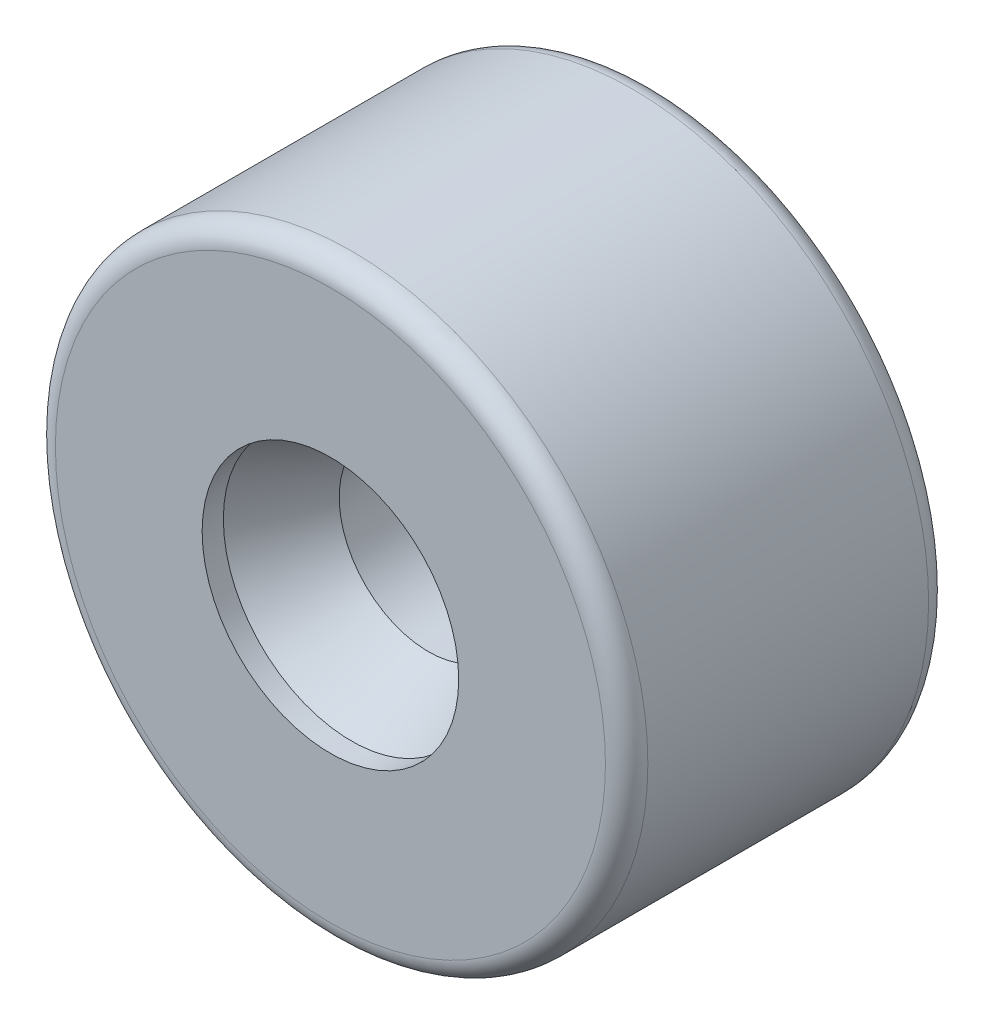
ISO-10303-21;
HEADER;
FILE_DESCRIPTION(('STEP AP214'),'2;1');
FILE_NAME('part.step','',(''),(''),'','','');
FILE_SCHEMA(('AUTOMOTIVE_DESIGN { 1 0 10303 214 1 1 1 1 }'));
ENDSEC;
DATA;
#1=APPLICATION_CONTEXT('core data for automotive mechanical design processes');
#2=APPLICATION_PROTOCOL_DEFINITION('international standard','automotive_design',2000,#1);
#3=PRODUCT_CONTEXT('',#1,'mechanical');
#4=PRODUCT('Part','Part','',(#3));
#5=PRODUCT_RELATED_PRODUCT_CATEGORY('part','',(#4));
#6=PRODUCT_DEFINITION_FORMATION('','',#4);
#7=PRODUCT_DEFINITION_CONTEXT('part definition',#1,'design');
#8=PRODUCT_DEFINITION('design','',#6,#7);
#9=PRODUCT_DEFINITION_SHAPE('','',#8);
#10=(LENGTH_UNIT() NAMED_UNIT(*) SI_UNIT(.MILLI.,.METRE.));
#11=(NAMED_UNIT(*) PLANE_ANGLE_UNIT() SI_UNIT($,.RADIAN.));
#12=(NAMED_UNIT(*) SI_UNIT($,.STERADIAN.) SOLID_ANGLE_UNIT());
#13=UNCERTAINTY_MEASURE_WITH_UNIT(LENGTH_MEASURE(1.E-05),#10,'distance_accuracy_value','');
#14=(GEOMETRIC_REPRESENTATION_CONTEXT(3) GLOBAL_UNCERTAINTY_ASSIGNED_CONTEXT((#13)) GLOBAL_UNIT_ASSIGNED_CONTEXT((#10,
#11,#12)) REPRESENTATION_CONTEXT('',''));
#15=CARTESIAN_POINT('',(0.,0.,0.));
#16=DIRECTION('',(0.,0.,1.));
#17=DIRECTION('',(1.,0.,0.));
#18=AXIS2_PLACEMENT_3D('',#15,#16,#17);
#19=CARTESIAN_POINT('',(0.,63.5000000000001,-76.2));
#20=DIRECTION('',(0.,0.,1.));
#21=DIRECTION('',(1.,0.,0.));
#22=AXIS2_PLACEMENT_3D('',#19,#20,#21);
#23=PLANE('',#22);
#24=CARTESIAN_POINT('',(0.,0.,-76.2));
#25=DIRECTION('',(0.,0.,1.));
#26=DIRECTION('',(1.,0.,0.));
#27=AXIS2_PLACEMENT_3D('',#24,#25,#26);
#28=CIRCLE('',#27,60.5000000000001);
#29=CARTESIAN_POINT('',(60.5000000000001,0.,-76.2));
#30=VERTEX_POINT('',#29);
#31=EDGE_CURVE('E10',#30,#30,#28,.T.);
#32=ORIENTED_EDGE('',*,*,#31,.T.);
#33=EDGE_LOOP('',(#32));
#34=FACE_BOUND('',#33,.T.);
#35=CARTESIAN_POINT('',(0.,0.,-76.2));
#36=DIRECTION('',(0.,0.,1.));
#37=DIRECTION('',(1.,0.,0.));
#38=AXIS2_PLACEMENT_3D('',#35,#36,#37);
#39=CIRCLE('',#38,129.7);
#40=CARTESIAN_POINT('',(129.7,0.,-76.2));
#41=VERTEX_POINT('',#40);
#42=EDGE_CURVE('E153',#41,#41,#39,.T.);
#43=ORIENTED_EDGE('',*,*,#42,.F.);
#44=EDGE_LOOP('',(#43));
#45=FACE_BOUND('',#44,.T.);
#46=ADVANCED_FACE('F37',(#34,#45),#23,.F.);
#47=CARTESIAN_POINT('',(0.,0.,361.478930537487));
#48=DIRECTION('',(0.,0.,1.));
#49=DIRECTION('',(1.,0.,0.));
#50=AXIS2_PLACEMENT_3D('',#47,#48,#49);
#51=CYLINDRICAL_SURFACE('',#50,60.5000000000001);
#52=ORIENTED_EDGE('',*,*,#31,.F.);
#53=EDGE_LOOP('',(#52));
#54=FACE_BOUND('',#53,.T.);
#55=CARTESIAN_POINT('',(0.,0.,-66.2));
#56=DIRECTION('',(0.,0.,1.));
#57=DIRECTION('',(1.,0.,0.));
#58=AXIS2_PLACEMENT_3D('',#55,#56,#57);
#59=CIRCLE('',#58,60.5000000000001);
#60=CARTESIAN_POINT('',(60.5000000000001,0.,-66.2));
#61=VERTEX_POINT('',#60);
#62=EDGE_CURVE('E44',#61,#61,#59,.T.);
#63=ORIENTED_EDGE('',*,*,#62,.T.);
#64=EDGE_LOOP('',(#63));
#65=FACE_BOUND('',#64,.T.);
#66=ADVANCED_FACE('F145',(#54,#65),#51,.F.);
#67=CARTESIAN_POINT('',(0.,0.,-30.));
#68=DIRECTION('',(0.,0.,-1.));
#69=DIRECTION('',(-1.,0.,0.));
#70=AXIS2_PLACEMENT_3D('',#67,#68,#69);
#71=CONICAL_SURFACE('',#70,42.0551787283017,0.471238898038469);
#72=ORIENTED_EDGE('',*,*,#62,.F.);
#73=EDGE_LOOP('',(#72));
#74=FACE_BOUND('',#73,.T.);
#75=CARTESIAN_POINT('',(0.,0.,-30.));
#76=DIRECTION('',(0.,0.,1.));
#77=DIRECTION('',(1.,0.,0.));
#78=AXIS2_PLACEMENT_3D('',#75,#76,#77);
#79=CIRCLE('',#78,42.0551787283017);
#80=CARTESIAN_POINT('',(42.0551787283017,0.,-30.));
#81=VERTEX_POINT('',#80);
#82=EDGE_CURVE('E49',#81,#81,#79,.T.);
#83=ORIENTED_EDGE('',*,*,#82,.T.);
#84=EDGE_LOOP('',(#83));
#85=FACE_BOUND('',#84,.T.);
#86=ADVANCED_FACE('F95',(#74,#85),#71,.F.);
#87=CARTESIAN_POINT('',(0.,0.,361.478930537487));
#88=DIRECTION('',(0.,0.,1.));
#89=DIRECTION('',(1.,0.,0.));
#90=AXIS2_PLACEMENT_3D('',#87,#88,#89);
#91=CYLINDRICAL_SURFACE('',#90,42.0551787283017);
#92=ORIENTED_EDGE('',*,*,#82,.F.);
#93=EDGE_LOOP('',(#92));
#94=FACE_BOUND('',#93,.T.);
#95=CARTESIAN_POINT('',(0.,0.,-1.5));
#96=DIRECTION('',(0.,0.,1.));
#97=DIRECTION('',(1.,0.,0.));
#98=AXIS2_PLACEMENT_3D('',#95,#96,#97);
#99=CIRCLE('',#98,42.0551787283017);
#100=CARTESIAN_POINT('',(42.0551787283017,0.,-1.5));
#101=VERTEX_POINT('',#100);
#102=EDGE_CURVE('E90',#101,#101,#99,.T.);
#103=ORIENTED_EDGE('',*,*,#102,.T.);
#104=EDGE_LOOP('',(#103));
#105=FACE_BOUND('',#104,.T.);
#106=ADVANCED_FACE('F97',(#94,#105),#91,.F.);
#107=CARTESIAN_POINT('',(0.,42.0551787283017,-1.5));
#108=DIRECTION('',(0.,0.,1.));
#109=DIRECTION('',(1.,0.,0.));
#110=AXIS2_PLACEMENT_3D('',#107,#108,#109);
#111=PLANE('',#110);
#112=CARTESIAN_POINT('',(0.,30.,-1.5));
#113=DIRECTION('',(0.,0.,-1.));
#114=DIRECTION('',(-1.,0.,0.));
#115=AXIS2_PLACEMENT_3D('',#112,#113,#114);
#116=CIRCLE('',#115,4.);
#117=CARTESIAN_POINT('',(-4.,30.,-1.5));
#118=VERTEX_POINT('',#117);
#119=EDGE_CURVE('E57',#118,#118,#116,.T.);
#120=ORIENTED_EDGE('',*,*,#119,.F.);
#121=EDGE_LOOP('',(#120));
#122=FACE_BOUND('',#121,.T.);
#123=CARTESIAN_POINT('',(30.,0.,-1.5));
#124=DIRECTION('',(0.,0.,-1.));
#125=DIRECTION('',(-1.,0.,0.));
#126=AXIS2_PLACEMENT_3D('',#123,#124,#125);
#127=CIRCLE('',#126,4.);
#128=CARTESIAN_POINT('',(26.,0.,-1.5));
#129=VERTEX_POINT('',#128);
#130=EDGE_CURVE('E173',#129,#129,#127,.T.);
#131=ORIENTED_EDGE('',*,*,#130,.F.);
#132=EDGE_LOOP('',(#131));
#133=FACE_BOUND('',#132,.T.);
#134=CARTESIAN_POINT('',(-30.,0.,-1.5));
#135=DIRECTION('',(0.,0.,-1.));
#136=DIRECTION('',(-1.,0.,0.));
#137=AXIS2_PLACEMENT_3D('',#134,#135,#136);
#138=CIRCLE('',#137,4.00000000000001);
#139=CARTESIAN_POINT('',(-34.,0.,-1.5));
#140=VERTEX_POINT('',#139);
#141=EDGE_CURVE('E175',#140,#140,#138,.T.);
#142=ORIENTED_EDGE('',*,*,#141,.F.);
#143=EDGE_LOOP('',(#142));
#144=FACE_BOUND('',#143,.T.);
#145=CARTESIAN_POINT('',(0.,-30.,-1.5));
#146=DIRECTION('',(0.,0.,-1.));
#147=DIRECTION('',(-1.,0.,0.));
#148=AXIS2_PLACEMENT_3D('',#145,#146,#147);
#149=CIRCLE('',#148,4.);
#150=CARTESIAN_POINT('',(-4.,-30.,-1.5));
#151=VERTEX_POINT('',#150);
#152=EDGE_CURVE('E76',#151,#151,#149,.T.);
#153=ORIENTED_EDGE('',*,*,#152,.F.);
#154=EDGE_LOOP('',(#153));
#155=FACE_BOUND('',#154,.T.);
#156=ORIENTED_EDGE('',*,*,#102,.F.);
#157=EDGE_LOOP('',(#156));
#158=FACE_BOUND('',#157,.T.);
#159=CARTESIAN_POINT('',(0.,0.,-1.5));
#160=DIRECTION('',(0.,0.,1.));
#161=DIRECTION('',(1.,0.,0.));
#162=AXIS2_PLACEMENT_3D('',#159,#160,#161);
#163=CIRCLE('',#162,10.);
#164=CARTESIAN_POINT('',(10.,0.,-1.5));
#165=VERTEX_POINT('',#164);
#166=EDGE_CURVE('E87',#165,#165,#163,.T.);
#167=ORIENTED_EDGE('',*,*,#166,.T.);
#168=EDGE_LOOP('',(#167));
#169=FACE_BOUND('',#168,.T.);
#170=ADVANCED_FACE('F100',(#122,#133,#144,#155,#158,#169),#111,.F.);
#171=CARTESIAN_POINT('',(0.,0.,361.478930537487));
#172=DIRECTION('',(0.,0.,1.));
#173=DIRECTION('',(1.,0.,0.));
#174=AXIS2_PLACEMENT_3D('',#171,#172,#173);
#175=CYLINDRICAL_SURFACE('',#174,10.);
#176=ORIENTED_EDGE('',*,*,#166,.F.);
#177=EDGE_LOOP('',(#176));
#178=FACE_BOUND('',#177,.T.);
#179=CARTESIAN_POINT('',(0.,0.,1.5));
#180=DIRECTION('',(0.,0.,1.));
#181=DIRECTION('',(1.,0.,0.));
#182=AXIS2_PLACEMENT_3D('',#179,#180,#181);
#183=CIRCLE('',#182,10.);
#184=CARTESIAN_POINT('',(10.,0.,1.5));
#185=VERTEX_POINT('',#184);
#186=EDGE_CURVE('E84',#185,#185,#183,.T.);
#187=ORIENTED_EDGE('',*,*,#186,.T.);
#188=EDGE_LOOP('',(#187));
#189=FACE_BOUND('',#188,.T.);
#190=ADVANCED_FACE('F106',(#178,#189),#175,.F.);
#191=CARTESIAN_POINT('',(0.,42.0551787283017,1.5));
#192=DIRECTION('',(0.,0.,-1.));
#193=DIRECTION('',(-1.,0.,0.));
#194=AXIS2_PLACEMENT_3D('',#191,#192,#193);
#195=PLANE('',#194);
#196=CARTESIAN_POINT('',(0.,30.,1.5));
#197=DIRECTION('',(0.,0.,-1.));
#198=DIRECTION('',(-1.,0.,0.));
#199=AXIS2_PLACEMENT_3D('',#196,#197,#198);
#200=CIRCLE('',#199,4.);
#201=CARTESIAN_POINT('',(-4.,30.,1.5));
#202=VERTEX_POINT('',#201);
#203=EDGE_CURVE('E40',#202,#202,#200,.T.);
#204=ORIENTED_EDGE('',*,*,#203,.T.);
#205=EDGE_LOOP('',(#204));
#206=FACE_BOUND('',#205,.T.);
#207=CARTESIAN_POINT('',(30.,0.,1.5));
#208=DIRECTION('',(0.,0.,-1.));
#209=DIRECTION('',(-1.,0.,0.));
#210=AXIS2_PLACEMENT_3D('',#207,#208,#209);
#211=CIRCLE('',#210,4.);
#212=CARTESIAN_POINT('',(26.,0.,1.5));
#213=VERTEX_POINT('',#212);
#214=EDGE_CURVE('E59',#213,#213,#211,.T.);
#215=ORIENTED_EDGE('',*,*,#214,.T.);
#216=EDGE_LOOP('',(#215));
#217=FACE_BOUND('',#216,.T.);
#218=CARTESIAN_POINT('',(-30.,0.,1.5));
#219=DIRECTION('',(0.,0.,-1.));
#220=DIRECTION('',(-1.,0.,0.));
#221=AXIS2_PLACEMENT_3D('',#218,#219,#220);
#222=CIRCLE('',#221,4.00000000000001);
#223=CARTESIAN_POINT('',(-34.,0.,1.5));
#224=VERTEX_POINT('',#223);
#225=EDGE_CURVE('E56',#224,#224,#222,.T.);
#226=ORIENTED_EDGE('',*,*,#225,.T.);
#227=EDGE_LOOP('',(#226));
#228=FACE_BOUND('',#227,.T.);
#229=CARTESIAN_POINT('',(0.,-30.,1.5));
#230=DIRECTION('',(0.,0.,-1.));
#231=DIRECTION('',(-1.,0.,0.));
#232=AXIS2_PLACEMENT_3D('',#229,#230,#231);
#233=CIRCLE('',#232,4.);
#234=CARTESIAN_POINT('',(-4.,-30.,1.5));
#235=VERTEX_POINT('',#234);
#236=EDGE_CURVE('E53',#235,#235,#233,.T.);
#237=ORIENTED_EDGE('',*,*,#236,.T.);
#238=EDGE_LOOP('',(#237));
#239=FACE_BOUND('',#238,.T.);
#240=ORIENTED_EDGE('',*,*,#186,.F.);
#241=EDGE_LOOP('',(#240));
#242=FACE_BOUND('',#241,.T.);
#243=CARTESIAN_POINT('',(0.,0.,1.5));
#244=DIRECTION('',(0.,0.,1.));
#245=DIRECTION('',(1.,0.,0.));
#246=AXIS2_PLACEMENT_3D('',#243,#244,#245);
#247=CIRCLE('',#246,42.0551787283017);
#248=CARTESIAN_POINT('',(42.0551787283017,0.,1.5));
#249=VERTEX_POINT('',#248);
#250=EDGE_CURVE('E81',#249,#249,#247,.T.);
#251=ORIENTED_EDGE('',*,*,#250,.T.);
#252=EDGE_LOOP('',(#251));
#253=FACE_BOUND('',#252,.T.);
#254=ADVANCED_FACE('F113',(#206,#217,#228,#239,#242,#253),#195,.F.);
#255=CARTESIAN_POINT('',(0.,0.,361.478930537487));
#256=DIRECTION('',(0.,0.,1.));
#257=DIRECTION('',(1.,0.,0.));
#258=AXIS2_PLACEMENT_3D('',#255,#256,#257);
#259=CYLINDRICAL_SURFACE('',#258,42.0551787283017);
#260=ORIENTED_EDGE('',*,*,#250,.F.);
#261=EDGE_LOOP('',(#260));
#262=FACE_BOUND('',#261,.T.);
#263=CARTESIAN_POINT('',(0.,0.,30.));
#264=DIRECTION('',(0.,0.,1.));
#265=DIRECTION('',(1.,0.,0.));
#266=AXIS2_PLACEMENT_3D('',#263,#264,#265);
#267=CIRCLE('',#266,42.0551787283017);
#268=CARTESIAN_POINT('',(42.0551787283017,0.,30.));
#269=VERTEX_POINT('',#268);
#270=EDGE_CURVE('E73',#269,#269,#267,.T.);
#271=ORIENTED_EDGE('',*,*,#270,.T.);
#272=EDGE_LOOP('',(#271));
#273=FACE_BOUND('',#272,.T.);
#274=ADVANCED_FACE('F119',(#262,#273),#259,.F.);
#275=CARTESIAN_POINT('',(0.,0.,66.2));
#276=DIRECTION('',(0.,0.,1.));
#277=DIRECTION('',(1.,0.,0.));
#278=AXIS2_PLACEMENT_3D('',#275,#276,#277);
#279=CONICAL_SURFACE('',#278,60.5000000000001,0.47123889803847);
#280=ORIENTED_EDGE('',*,*,#270,.F.);
#281=EDGE_LOOP('',(#280));
#282=FACE_BOUND('',#281,.T.);
#283=CARTESIAN_POINT('',(0.,0.,66.2));
#284=DIRECTION('',(0.,0.,1.));
#285=DIRECTION('',(1.,0.,0.));
#286=AXIS2_PLACEMENT_3D('',#283,#284,#285);
#287=CIRCLE('',#286,60.5000000000001);
#288=CARTESIAN_POINT('',(60.5000000000001,0.,66.2));
#289=VERTEX_POINT('',#288);
#290=EDGE_CURVE('E68',#289,#289,#287,.T.);
#291=ORIENTED_EDGE('',*,*,#290,.T.);
#292=EDGE_LOOP('',(#291));
#293=FACE_BOUND('',#292,.T.);
#294=ADVANCED_FACE('F125',(#282,#293),#279,.F.);
#295=CARTESIAN_POINT('',(0.,0.,361.478930537487));
#296=DIRECTION('',(0.,0.,1.));
#297=DIRECTION('',(1.,0.,0.));
#298=AXIS2_PLACEMENT_3D('',#295,#296,#297);
#299=CYLINDRICAL_SURFACE('',#298,60.5000000000001);
#300=ORIENTED_EDGE('',*,*,#290,.F.);
#301=EDGE_LOOP('',(#300));
#302=FACE_BOUND('',#301,.T.);
#303=CARTESIAN_POINT('',(0.,0.,76.2));
#304=DIRECTION('',(0.,0.,1.));
#305=DIRECTION('',(1.,0.,0.));
#306=AXIS2_PLACEMENT_3D('',#303,#304,#305);
#307=CIRCLE('',#306,60.5000000000001);
#308=CARTESIAN_POINT('',(60.5000000000001,0.,76.2));
#309=VERTEX_POINT('',#308);
#310=EDGE_CURVE('E64',#309,#309,#307,.T.);
#311=ORIENTED_EDGE('',*,*,#310,.T.);
#312=EDGE_LOOP('',(#311));
#313=FACE_BOUND('',#312,.T.);
#314=ADVANCED_FACE('F131',(#302,#313),#299,.F.);
#315=CARTESIAN_POINT('',(0.,63.5000000000001,76.2));
#316=DIRECTION('',(0.,0.,-1.));
#317=DIRECTION('',(-1.,0.,0.));
#318=AXIS2_PLACEMENT_3D('',#315,#316,#317);
#319=PLANE('',#318);
#320=ORIENTED_EDGE('',*,*,#310,.F.);
#321=EDGE_LOOP('',(#320));
#322=FACE_BOUND('',#321,.T.);
#323=CARTESIAN_POINT('',(0.,0.,76.2));
#324=DIRECTION('',(0.,0.,1.));
#325=DIRECTION('',(1.,0.,0.));
#326=AXIS2_PLACEMENT_3D('',#323,#324,#325);
#327=CIRCLE('',#326,129.7);
#328=CARTESIAN_POINT('',(129.7,0.,76.2));
#329=VERTEX_POINT('',#328);
#330=EDGE_CURVE('E155',#329,#329,#327,.T.);
#331=ORIENTED_EDGE('',*,*,#330,.T.);
#332=EDGE_LOOP('',(#331));
#333=FACE_BOUND('',#332,.T.);
#334=ADVANCED_FACE('F136',(#322,#333),#319,.F.);
#335=CARTESIAN_POINT('',(0.,-30.,8.5));
#336=DIRECTION('',(0.,0.,-1.));
#337=DIRECTION('',(-1.,0.,0.));
#338=AXIS2_PLACEMENT_3D('',#335,#336,#337);
#339=CYLINDRICAL_SURFACE('',#338,4.);
#340=ORIENTED_EDGE('',*,*,#152,.T.);
#341=EDGE_LOOP('',(#340));
#342=FACE_BOUND('',#341,.T.);
#343=ORIENTED_EDGE('',*,*,#236,.F.);
#344=EDGE_LOOP('',(#343));
#345=FACE_BOUND('',#344,.T.);
#346=ADVANCED_FACE('F141',(#342,#345),#339,.F.);
#347=CARTESIAN_POINT('',(-30.,0.,8.5));
#348=DIRECTION('',(0.,0.,-1.));
#349=DIRECTION('',(-1.,0.,0.));
#350=AXIS2_PLACEMENT_3D('',#347,#348,#349);
#351=CYLINDRICAL_SURFACE('',#350,4.00000000000001);
#352=ORIENTED_EDGE('',*,*,#141,.T.);
#353=EDGE_LOOP('',(#352));
#354=FACE_BOUND('',#353,.T.);
#355=ORIENTED_EDGE('',*,*,#225,.F.);
#356=EDGE_LOOP('',(#355));
#357=FACE_BOUND('',#356,.T.);
#358=ADVANCED_FACE('F185',(#354,#357),#351,.F.);
#359=CARTESIAN_POINT('',(30.,0.,8.5));
#360=DIRECTION('',(0.,0.,-1.));
#361=DIRECTION('',(-1.,0.,0.));
#362=AXIS2_PLACEMENT_3D('',#359,#360,#361);
#363=CYLINDRICAL_SURFACE('',#362,4.);
#364=ORIENTED_EDGE('',*,*,#130,.T.);
#365=EDGE_LOOP('',(#364));
#366=FACE_BOUND('',#365,.T.);
#367=ORIENTED_EDGE('',*,*,#214,.F.);
#368=EDGE_LOOP('',(#367));
#369=FACE_BOUND('',#368,.T.);
#370=ADVANCED_FACE('F192',(#366,#369),#363,.F.);
#371=CARTESIAN_POINT('',(0.,30.,8.5));
#372=DIRECTION('',(0.,0.,-1.));
#373=DIRECTION('',(-1.,0.,0.));
#374=AXIS2_PLACEMENT_3D('',#371,#372,#373);
#375=CYLINDRICAL_SURFACE('',#374,4.);
#376=ORIENTED_EDGE('',*,*,#119,.T.);
#377=EDGE_LOOP('',(#376));
#378=FACE_BOUND('',#377,.T.);
#379=ORIENTED_EDGE('',*,*,#203,.F.);
#380=EDGE_LOOP('',(#379));
#381=FACE_BOUND('',#380,.T.);
#382=ADVANCED_FACE('F197',(#378,#381),#375,.F.);
#383=CARTESIAN_POINT('',(0.,0.,-66.2));
#384=DIRECTION('',(0.,0.,1.));
#385=DIRECTION('',(1.,0.,0.));
#386=AXIS2_PLACEMENT_3D('',#383,#384,#385);
#387=TOROIDAL_SURFACE('',#386,129.7,10.);
#388=CARTESIAN_POINT('',(0.,0.,-66.2));
#389=DIRECTION('',(0.,0.,1.));
#390=DIRECTION('',(1.,0.,0.));
#391=AXIS2_PLACEMENT_3D('',#388,#389,#390);
#392=CIRCLE('',#391,139.7);
#393=CARTESIAN_POINT('',(139.7,0.,-66.2));
#394=VERTEX_POINT('',#393);
#395=EDGE_CURVE('E168',#394,#394,#392,.T.);
#396=ORIENTED_EDGE('',*,*,#395,.F.);
#397=EDGE_LOOP('',(#396));
#398=FACE_BOUND('',#397,.T.);
#399=ORIENTED_EDGE('',*,*,#42,.T.);
#400=EDGE_LOOP('',(#399));
#401=FACE_BOUND('',#400,.T.);
#402=ADVANCED_FACE('F201',(#398,#401),#387,.T.);
#403=CARTESIAN_POINT('',(0.,0.,155.803154022345));
#404=DIRECTION('',(0.,0.,1.));
#405=DIRECTION('',(1.,0.,0.));
#406=AXIS2_PLACEMENT_3D('',#403,#404,#405);
#407=CYLINDRICAL_SURFACE('',#406,139.7);
#408=CARTESIAN_POINT('',(0.,0.,66.2));
#409=DIRECTION('',(0.,0.,1.));
#410=DIRECTION('',(1.,0.,0.));
#411=AXIS2_PLACEMENT_3D('',#408,#409,#410);
#412=CIRCLE('',#411,139.7);
#413=CARTESIAN_POINT('',(139.7,0.,66.2));
#414=VERTEX_POINT('',#413);
#415=EDGE_CURVE('E159',#414,#414,#412,.T.);
#416=ORIENTED_EDGE('',*,*,#415,.F.);
#417=EDGE_LOOP('',(#416));
#418=FACE_BOUND('',#417,.T.);
#419=ORIENTED_EDGE('',*,*,#395,.T.);
#420=EDGE_LOOP('',(#419));
#421=FACE_BOUND('',#420,.T.);
#422=ADVANCED_FACE('F205',(#418,#421),#407,.T.);
#423=CARTESIAN_POINT('',(0.,0.,66.2));
#424=DIRECTION('',(0.,0.,1.));
#425=DIRECTION('',(1.,0.,0.));
#426=AXIS2_PLACEMENT_3D('',#423,#424,#425);
#427=TOROIDAL_SURFACE('',#426,129.7,10.);
#428=ORIENTED_EDGE('',*,*,#330,.F.);
#429=EDGE_LOOP('',(#428));
#430=FACE_BOUND('',#429,.T.);
#431=ORIENTED_EDGE('',*,*,#415,.T.);
#432=EDGE_LOOP('',(#431));
#433=FACE_BOUND('',#432,.T.);
#434=ADVANCED_FACE('F209',(#430,#433),#427,.T.);
#435=CLOSED_SHELL('',(#46,#66,#86,#106,#170,#190,#254,#274,#294,#314,#334,#346,#358,#370,#382,
#402,#422,#434));
#436=CARTESIAN_POINT('',(0.,0.,155.803154022345));
#437=DIRECTION('',(0.,0.,1.));
#438=DIRECTION('',(1.,0.,0.));
#439=AXIS2_PLACEMENT_3D('',#436,#437,#438);
#440=CYLINDRICAL_SURFACE('',#439,70.9999999999999);
#441=CARTESIAN_POINT('',(0.,0.,-68.7000000000001));
#442=DIRECTION('',(0.,0.,1.));
#443=DIRECTION('',(1.,0.,0.));
#444=AXIS2_PLACEMENT_3D('',#441,#442,#443);
#445=CIRCLE('',#444,70.9999999999999);
#446=CARTESIAN_POINT('',(70.9999999999999,0.,-68.7000000000001));
#447=VERTEX_POINT('',#446);
#448=EDGE_CURVE('E263',#447,#447,#445,.T.);
#449=ORIENTED_EDGE('',*,*,#448,.T.);
#450=EDGE_LOOP('',(#449));
#451=FACE_BOUND('',#450,.T.);
#452=CARTESIAN_POINT('',(0.,0.,-63.8935756466989));
#453=DIRECTION('',(0.,0.,1.));
#454=DIRECTION('',(1.,0.,0.));
#455=AXIS2_PLACEMENT_3D('',#452,#453,#454);
#456=CIRCLE('',#455,70.9999999999999);
#457=CARTESIAN_POINT('',(70.9999999999999,0.,-63.8935756466989));
#458=VERTEX_POINT('',#457);
#459=EDGE_CURVE('E156',#458,#458,#456,.T.);
#460=ORIENTED_EDGE('',*,*,#459,.F.);
#461=EDGE_LOOP('',(#460));
#462=FACE_BOUND('',#461,.T.);
#463=ADVANCED_FACE('F214',(#451,#462),#440,.T.);
#464=CARTESIAN_POINT('',(0.,0.,-27.9467878233495));
#465=DIRECTION('',(0.,0.,-1.));
#466=DIRECTION('',(-1.,0.,0.));
#467=AXIS2_PLACEMENT_3D('',#464,#465,#466);
#468=CONICAL_SURFACE('',#467,52.6841967764269,0.47123889803847);
#469=ORIENTED_EDGE('',*,*,#459,.T.);
#470=EDGE_LOOP('',(#469));
#471=FACE_BOUND('',#470,.T.);
#472=CARTESIAN_POINT('',(0.,0.,-27.9467878233495));
#473=DIRECTION('',(0.,0.,1.));
#474=DIRECTION('',(1.,0.,0.));
#475=AXIS2_PLACEMENT_3D('',#472,#473,#474);
#476=CIRCLE('',#475,52.6841967764269);
#477=CARTESIAN_POINT('',(52.6841967764269,0.,-27.9467878233495));
#478=VERTEX_POINT('',#477);
#479=EDGE_CURVE('E162',#478,#478,#476,.T.);
#480=ORIENTED_EDGE('',*,*,#479,.F.);
#481=EDGE_LOOP('',(#480));
#482=FACE_BOUND('',#481,.T.);
#483=ADVANCED_FACE('F217',(#471,#482),#468,.T.);
#484=CARTESIAN_POINT('',(0.,0.,155.803154022345));
#485=DIRECTION('',(0.,0.,1.));
#486=DIRECTION('',(1.,0.,0.));
#487=AXIS2_PLACEMENT_3D('',#484,#485,#486);
#488=CYLINDRICAL_SURFACE('',#487,52.6841967764269);
#489=ORIENTED_EDGE('',*,*,#479,.T.);
#490=EDGE_LOOP('',(#489));
#491=FACE_BOUND('',#490,.T.);
#492=CARTESIAN_POINT('',(0.,0.,28.4532121766505));
#493=DIRECTION('',(0.,0.,1.));
#494=DIRECTION('',(1.,0.,0.));
#495=AXIS2_PLACEMENT_3D('',#492,#493,#494);
#496=CIRCLE('',#495,52.6841967764269);
#497=CARTESIAN_POINT('',(52.6841967764269,0.,28.4532121766505));
#498=VERTEX_POINT('',#497);
#499=EDGE_CURVE('E282',#498,#498,#496,.T.);
#500=ORIENTED_EDGE('',*,*,#499,.F.);
#501=EDGE_LOOP('',(#500));
#502=FACE_BOUND('',#501,.T.);
#503=ADVANCED_FACE('F222',(#491,#502),#488,.T.);
#504=CARTESIAN_POINT('',(0.,0.,64.4));
#505=DIRECTION('',(0.,0.,1.));
#506=DIRECTION('',(1.,0.,0.));
#507=AXIS2_PLACEMENT_3D('',#504,#505,#506);
#508=CONICAL_SURFACE('',#507,70.9999999999999,0.47123889803847);
#509=ORIENTED_EDGE('',*,*,#499,.T.);
#510=EDGE_LOOP('',(#509));
#511=FACE_BOUND('',#510,.T.);
#512=CARTESIAN_POINT('',(0.,0.,64.4));
#513=DIRECTION('',(0.,0.,1.));
#514=DIRECTION('',(1.,0.,0.));
#515=AXIS2_PLACEMENT_3D('',#512,#513,#514);
#516=CIRCLE('',#515,70.9999999999999);
#517=CARTESIAN_POINT('',(70.9999999999999,0.,64.4));
#518=VERTEX_POINT('',#517);
#519=EDGE_CURVE('E279',#518,#518,#516,.T.);
#520=ORIENTED_EDGE('',*,*,#519,.F.);
#521=EDGE_LOOP('',(#520));
#522=FACE_BOUND('',#521,.T.);
#523=ADVANCED_FACE('F226',(#511,#522),#508,.T.);
#524=CARTESIAN_POINT('',(0.,0.,155.803154022345));
#525=DIRECTION('',(0.,0.,1.));
#526=DIRECTION('',(1.,0.,0.));
#527=AXIS2_PLACEMENT_3D('',#524,#525,#526);
#528=CYLINDRICAL_SURFACE('',#527,70.9999999999999);
#529=ORIENTED_EDGE('',*,*,#519,.T.);
#530=EDGE_LOOP('',(#529));
#531=FACE_BOUND('',#530,.T.);
#532=CARTESIAN_POINT('',(0.,0.,68.7));
#533=DIRECTION('',(0.,0.,1.));
#534=DIRECTION('',(1.,0.,0.));
#535=AXIS2_PLACEMENT_3D('',#532,#533,#534);
#536=CIRCLE('',#535,70.9999999999999);
#537=CARTESIAN_POINT('',(70.9999999999999,0.,68.7));
#538=VERTEX_POINT('',#537);
#539=EDGE_CURVE('E276',#538,#538,#536,.T.);
#540=ORIENTED_EDGE('',*,*,#539,.F.);
#541=EDGE_LOOP('',(#540));
#542=FACE_BOUND('',#541,.T.);
#543=ADVANCED_FACE('F230',(#531,#542),#528,.T.);
#544=CARTESIAN_POINT('',(0.,70.9999999999999,68.7));
#545=DIRECTION('',(0.,0.,-1.));
#546=DIRECTION('',(-1.,0.,0.));
#547=AXIS2_PLACEMENT_3D('',#544,#545,#546);
#548=PLANE('',#547);
#549=ORIENTED_EDGE('',*,*,#539,.T.);
#550=EDGE_LOOP('',(#549));
#551=FACE_BOUND('',#550,.T.);
#552=CARTESIAN_POINT('',(0.,0.,68.7));
#553=DIRECTION('',(0.,0.,1.));
#554=DIRECTION('',(1.,0.,0.));
#555=AXIS2_PLACEMENT_3D('',#552,#553,#554);
#556=CIRCLE('',#555,127.2);
#557=CARTESIAN_POINT('',(127.2,0.,68.7));
#558=VERTEX_POINT('',#557);
#559=EDGE_CURVE('E273',#558,#558,#556,.T.);
#560=ORIENTED_EDGE('',*,*,#559,.F.);
#561=EDGE_LOOP('',(#560));
#562=FACE_BOUND('',#561,.T.);
#563=ADVANCED_FACE('F234',(#551,#562),#548,.T.);
#564=CARTESIAN_POINT('',(0.,0.,66.2));
#565=DIRECTION('',(0.,0.,1.));
#566=DIRECTION('',(1.,0.,0.));
#567=AXIS2_PLACEMENT_3D('',#564,#565,#566);
#568=TOROIDAL_SURFACE('',#567,127.2,2.5);
#569=ORIENTED_EDGE('',*,*,#559,.T.);
#570=EDGE_LOOP('',(#569));
#571=FACE_BOUND('',#570,.T.);
#572=CARTESIAN_POINT('',(0.,0.,66.2));
#573=DIRECTION('',(0.,0.,1.));
#574=DIRECTION('',(1.,0.,0.));
#575=AXIS2_PLACEMENT_3D('',#572,#573,#574);
#576=CIRCLE('',#575,129.7);
#577=CARTESIAN_POINT('',(129.7,0.,66.2));
#578=VERTEX_POINT('',#577);
#579=EDGE_CURVE('E270',#578,#578,#576,.T.);
#580=ORIENTED_EDGE('',*,*,#579,.F.);
#581=EDGE_LOOP('',(#580));
#582=FACE_BOUND('',#581,.T.);
#583=ADVANCED_FACE('F238',(#571,#582),#568,.F.);
#584=CARTESIAN_POINT('',(0.,0.,155.803154022345));
#585=DIRECTION('',(0.,0.,1.));
#586=DIRECTION('',(1.,0.,0.));
#587=AXIS2_PLACEMENT_3D('',#584,#585,#586);
#588=CYLINDRICAL_SURFACE('',#587,129.7);
#589=ORIENTED_EDGE('',*,*,#579,.T.);
#590=EDGE_LOOP('',(#589));
#591=FACE_BOUND('',#590,.T.);
#592=CARTESIAN_POINT('',(0.,0.,-66.2));
#593=DIRECTION('',(0.,0.,1.));
#594=DIRECTION('',(1.,0.,0.));
#595=AXIS2_PLACEMENT_3D('',#592,#593,#594);
#596=CIRCLE('',#595,129.7);
#597=CARTESIAN_POINT('',(129.7,0.,-66.2));
#598=VERTEX_POINT('',#597);
#599=EDGE_CURVE('E265',#598,#598,#596,.T.);
#600=ORIENTED_EDGE('',*,*,#599,.F.);
#601=EDGE_LOOP('',(#600));
#602=FACE_BOUND('',#601,.T.);
#603=ADVANCED_FACE('F242',(#591,#602),#588,.F.);
#604=CARTESIAN_POINT('',(0.,0.,-66.2));
#605=DIRECTION('',(0.,0.,1.));
#606=DIRECTION('',(1.,0.,0.));
#607=AXIS2_PLACEMENT_3D('',#604,#605,#606);
#608=TOROIDAL_SURFACE('',#607,127.2,2.5);
#609=ORIENTED_EDGE('',*,*,#599,.T.);
#610=EDGE_LOOP('',(#609));
#611=FACE_BOUND('',#610,.T.);
#612=CARTESIAN_POINT('',(0.,0.,-68.7));
#613=DIRECTION('',(0.,0.,1.));
#614=DIRECTION('',(1.,0.,0.));
#615=AXIS2_PLACEMENT_3D('',#612,#613,#614);
#616=CIRCLE('',#615,127.2);
#617=CARTESIAN_POINT('',(127.2,0.,-68.7));
#618=VERTEX_POINT('',#617);
#619=EDGE_CURVE('E260',#618,#618,#616,.T.);
#620=ORIENTED_EDGE('',*,*,#619,.F.);
#621=EDGE_LOOP('',(#620));
#622=FACE_BOUND('',#621,.T.);
#623=ADVANCED_FACE('F246',(#611,#622),#608,.F.);
#624=CARTESIAN_POINT('',(0.,127.2,-68.7000000000001));
#625=DIRECTION('',(0.,0.,1.));
#626=DIRECTION('',(1.,0.,0.));
#627=AXIS2_PLACEMENT_3D('',#624,#625,#626);
#628=PLANE('',#627);
#629=ORIENTED_EDGE('',*,*,#619,.T.);
#630=EDGE_LOOP('',(#629));
#631=FACE_BOUND('',#630,.T.);
#632=ORIENTED_EDGE('',*,*,#448,.F.);
#633=EDGE_LOOP('',(#632));
#634=FACE_BOUND('',#633,.T.);
#635=ADVANCED_FACE('F250',(#631,#634),#628,.T.);
#636=CLOSED_SHELL('',(#463,#483,#503,#523,#543,#563,#583,#603,#623,#635));
#637=ORIENTED_CLOSED_SHELL('',*,#636,.T.);
#638=BREP_WITH_VOIDS('B2',#435,(#637));
#639=ADVANCED_BREP_SHAPE_REPRESENTATION('',(#18,#638),#14);
#640=SHAPE_DEFINITION_REPRESENTATION(#9,#639);
ENDSEC;
END-ISO-10303-21;
